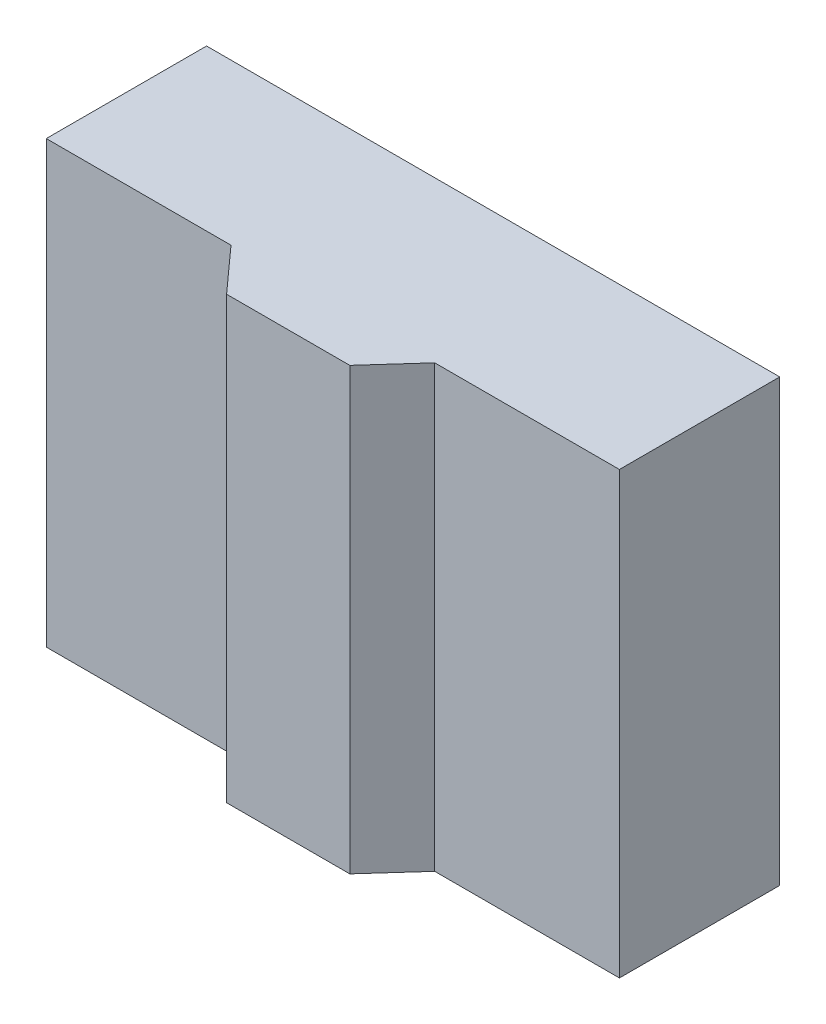
ISO-10303-21;
HEADER;
FILE_DESCRIPTION(('STEP AP214'),'2;1');
FILE_NAME('part.step','',(''),(''),'','','');
FILE_SCHEMA(('AUTOMOTIVE_DESIGN { 1 0 10303 214 1 1 1 1 }'));
ENDSEC;
DATA;
#1=APPLICATION_CONTEXT('core data for automotive mechanical design processes');
#2=APPLICATION_PROTOCOL_DEFINITION('international standard','automotive_design',2000,#1);
#3=PRODUCT_CONTEXT('',#1,'mechanical');
#4=PRODUCT('Part','Part','',(#3));
#5=PRODUCT_RELATED_PRODUCT_CATEGORY('part','',(#4));
#6=PRODUCT_DEFINITION_FORMATION('','',#4);
#7=PRODUCT_DEFINITION_CONTEXT('part definition',#1,'design');
#8=PRODUCT_DEFINITION('design','',#6,#7);
#9=PRODUCT_DEFINITION_SHAPE('','',#8);
#10=(LENGTH_UNIT() NAMED_UNIT(*) SI_UNIT(.MILLI.,.METRE.));
#11=(NAMED_UNIT(*) PLANE_ANGLE_UNIT() SI_UNIT($,.RADIAN.));
#12=(NAMED_UNIT(*) SI_UNIT($,.STERADIAN.) SOLID_ANGLE_UNIT());
#13=UNCERTAINTY_MEASURE_WITH_UNIT(LENGTH_MEASURE(1.E-05),#10,'distance_accuracy_value','');
#14=(GEOMETRIC_REPRESENTATION_CONTEXT(3) GLOBAL_UNCERTAINTY_ASSIGNED_CONTEXT((#13)) GLOBAL_UNIT_ASSIGNED_CONTEXT((#10,
#11,#12)) REPRESENTATION_CONTEXT('',''));
#15=CARTESIAN_POINT('',(0.,0.,0.));
#16=DIRECTION('',(0.,0.,1.));
#17=DIRECTION('',(1.,0.,0.));
#18=AXIS2_PLACEMENT_3D('',#15,#16,#17);
#19=CARTESIAN_POINT('',(0.,-101.6,-36.9812244108649));
#20=DIRECTION('',(0.,0.,-1.));
#21=DIRECTION('',(-1.,0.,0.));
#22=AXIS2_PLACEMENT_3D('',#19,#20,#21);
#23=PLANE('',#22);
#24=DIRECTION('',(-1.,0.,0.));
#25=VECTOR('',#24,1.);
#26=CARTESIAN_POINT('',(0.,0.,-36.9812244108649));
#27=LINE('',#26,#25);
#28=CARTESIAN_POINT('',(132.222754501209,0.,-36.9812244108649));
#29=VERTEX_POINT('',#28);
#30=CARTESIAN_POINT('',(0.,0.,-36.9812244108649));
#31=VERTEX_POINT('',#30);
#32=EDGE_CURVE('E128',#29,#31,#27,.T.);
#33=ORIENTED_EDGE('',*,*,#32,.F.);
#34=DIRECTION('',(0.,1.,0.));
#35=VECTOR('',#34,1.);
#36=CARTESIAN_POINT('',(132.222754501209,-101.6,-36.9812244108649));
#37=LINE('',#36,#35);
#38=CARTESIAN_POINT('',(132.222754501209,-101.6,-36.9812244108649));
#39=VERTEX_POINT('',#38);
#40=EDGE_CURVE('E11',#39,#29,#37,.T.);
#41=ORIENTED_EDGE('',*,*,#40,.F.);
#42=DIRECTION('',(-1.,0.,0.));
#43=VECTOR('',#42,1.);
#44=CARTESIAN_POINT('',(0.,-101.6,-36.9812244108649));
#45=LINE('',#44,#43);
#46=CARTESIAN_POINT('',(0.,-101.6,-36.9812244108649));
#47=VERTEX_POINT('',#46);
#48=EDGE_CURVE('E148',#39,#47,#45,.T.);
#49=ORIENTED_EDGE('',*,*,#48,.T.);
#50=DIRECTION('',(0.,1.,0.));
#51=VECTOR('',#50,1.);
#52=CARTESIAN_POINT('',(0.,-101.6,-36.9812244108649));
#53=LINE('',#52,#51);
#54=EDGE_CURVE('E34',#47,#31,#53,.T.);
#55=ORIENTED_EDGE('',*,*,#54,.T.);
#56=EDGE_LOOP('',(#33,#41,#49,#55));
#57=FACE_BOUND('',#56,.T.);
#58=ADVANCED_FACE('F31',(#57),#23,.T.);
#59=CARTESIAN_POINT('',(132.222754501209,-101.6,-36.9812244108649));
#60=DIRECTION('',(1.,0.,0.));
#61=DIRECTION('',(0.,0.,-1.));
#62=AXIS2_PLACEMENT_3D('',#59,#60,#61);
#63=PLANE('',#62);
#64=DIRECTION('',(0.,0.,-1.));
#65=VECTOR('',#64,1.);
#66=CARTESIAN_POINT('',(132.222754501209,0.,-36.9812244108649));
#67=LINE('',#66,#65);
#68=CARTESIAN_POINT('',(132.222754501209,0.,0.));
#69=VERTEX_POINT('',#68);
#70=EDGE_CURVE('E146',#69,#29,#67,.T.);
#71=ORIENTED_EDGE('',*,*,#70,.F.);
#72=DIRECTION('',(0.,1.,0.));
#73=VECTOR('',#72,1.);
#74=CARTESIAN_POINT('',(132.222754501209,-101.6,0.));
#75=LINE('',#74,#73);
#76=CARTESIAN_POINT('',(132.222754501209,-101.6,0.));
#77=VERTEX_POINT('',#76);
#78=EDGE_CURVE('E40',#77,#69,#75,.T.);
#79=ORIENTED_EDGE('',*,*,#78,.F.);
#80=DIRECTION('',(0.,0.,-1.));
#81=VECTOR('',#80,1.);
#82=CARTESIAN_POINT('',(132.222754501209,-101.6,-36.9812244108649));
#83=LINE('',#82,#81);
#84=EDGE_CURVE('E118',#77,#39,#83,.T.);
#85=ORIENTED_EDGE('',*,*,#84,.T.);
#86=ORIENTED_EDGE('',*,*,#40,.T.);
#87=EDGE_LOOP('',(#71,#79,#85,#86));
#88=FACE_BOUND('',#87,.T.);
#89=ADVANCED_FACE('F160',(#88),#63,.T.);
#90=CARTESIAN_POINT('',(132.222754501209,-101.6,0.));
#91=DIRECTION('',(0.,0.,1.));
#92=DIRECTION('',(1.,0.,0.));
#93=AXIS2_PLACEMENT_3D('',#90,#91,#92);
#94=PLANE('',#93);
#95=DIRECTION('',(1.,0.,0.));
#96=VECTOR('',#95,1.);
#97=CARTESIAN_POINT('',(132.222754501209,0.,0.));
#98=LINE('',#97,#96);
#99=CARTESIAN_POINT('',(89.6074006792826,0.,0.));
#100=VERTEX_POINT('',#99);
#101=EDGE_CURVE('E105',#100,#69,#98,.T.);
#102=ORIENTED_EDGE('',*,*,#101,.F.);
#103=DIRECTION('',(0.,1.,0.));
#104=VECTOR('',#103,1.);
#105=CARTESIAN_POINT('',(89.6074006792826,-101.6,0.));
#106=LINE('',#105,#104);
#107=CARTESIAN_POINT('',(89.6074006792826,-101.6,0.));
#108=VERTEX_POINT('',#107);
#109=EDGE_CURVE('E100',#108,#100,#106,.T.);
#110=ORIENTED_EDGE('',*,*,#109,.F.);
#111=DIRECTION('',(1.,0.,0.));
#112=VECTOR('',#111,1.);
#113=CARTESIAN_POINT('',(132.222754501209,-101.6,0.));
#114=LINE('',#113,#112);
#115=EDGE_CURVE('E103',#108,#77,#114,.T.);
#116=ORIENTED_EDGE('',*,*,#115,.T.);
#117=ORIENTED_EDGE('',*,*,#78,.T.);
#118=EDGE_LOOP('',(#102,#110,#116,#117));
#119=FACE_BOUND('',#118,.T.);
#120=ADVANCED_FACE('F102',(#119),#94,.T.);
#121=CARTESIAN_POINT('',(89.6074006792826,-101.6,0.));
#122=DIRECTION('',(0.742879016624116,0.,0.669425699132911));
#123=DIRECTION('',(0.669425699132911,0.,-0.742879016624116));
#124=AXIS2_PLACEMENT_3D('',#121,#122,#123);
#125=PLANE('',#124);
#126=DIRECTION('',(0.669425699132911,0.,-0.742879016624116));
#127=VECTOR('',#126,1.);
#128=CARTESIAN_POINT('',(89.6074006792826,0.,0.));
#129=LINE('',#128,#127);
#130=CARTESIAN_POINT('',(80.3250210531382,0.,10.3008968098083));
#131=VERTEX_POINT('',#130);
#132=EDGE_CURVE('E143',#131,#100,#129,.T.);
#133=ORIENTED_EDGE('',*,*,#132,.F.);
#134=DIRECTION('',(0.,1.,0.));
#135=VECTOR('',#134,1.);
#136=CARTESIAN_POINT('',(80.3250210531382,-101.6,10.3008968098083));
#137=LINE('',#136,#135);
#138=CARTESIAN_POINT('',(80.3250210531382,-101.6,10.3008968098083));
#139=VERTEX_POINT('',#138);
#140=EDGE_CURVE('E110',#139,#131,#137,.T.);
#141=ORIENTED_EDGE('',*,*,#140,.F.);
#142=DIRECTION('',(0.669425699132911,0.,-0.742879016624116));
#143=VECTOR('',#142,1.);
#144=CARTESIAN_POINT('',(89.6074006792826,-101.6,0.));
#145=LINE('',#144,#143);
#146=EDGE_CURVE('E116',#139,#108,#145,.T.);
#147=ORIENTED_EDGE('',*,*,#146,.T.);
#148=ORIENTED_EDGE('',*,*,#109,.T.);
#149=EDGE_LOOP('',(#133,#141,#147,#148));
#150=FACE_BOUND('',#149,.T.);
#151=ADVANCED_FACE('F120',(#150),#125,.T.);
#152=CARTESIAN_POINT('',(51.8977334480709,-101.6,10.3008968098083));
#153=DIRECTION('',(0.,0.,1.));
#154=DIRECTION('',(1.,0.,0.));
#155=AXIS2_PLACEMENT_3D('',#152,#153,#154);
#156=PLANE('',#155);
#157=DIRECTION('',(1.,0.,0.));
#158=VECTOR('',#157,1.);
#159=CARTESIAN_POINT('',(51.8977334480709,0.,10.3008968098083));
#160=LINE('',#159,#158);
#161=CARTESIAN_POINT('',(51.8977334480709,0.,10.3008968098083));
#162=VERTEX_POINT('',#161);
#163=EDGE_CURVE('E140',#162,#131,#160,.T.);
#164=ORIENTED_EDGE('',*,*,#163,.F.);
#165=DIRECTION('',(0.,1.,0.));
#166=VECTOR('',#165,1.);
#167=CARTESIAN_POINT('',(51.8977334480709,-101.6,10.3008968098083));
#168=LINE('',#167,#166);
#169=CARTESIAN_POINT('',(51.8977334480709,-101.6,10.3008968098083));
#170=VERTEX_POINT('',#169);
#171=EDGE_CURVE('E152',#170,#162,#168,.T.);
#172=ORIENTED_EDGE('',*,*,#171,.F.);
#173=DIRECTION('',(1.,0.,0.));
#174=VECTOR('',#173,1.);
#175=CARTESIAN_POINT('',(51.8977334480709,-101.6,10.3008968098083));
#176=LINE('',#175,#174);
#177=EDGE_CURVE('E121',#170,#139,#176,.T.);
#178=ORIENTED_EDGE('',*,*,#177,.T.);
#179=ORIENTED_EDGE('',*,*,#140,.T.);
#180=EDGE_LOOP('',(#164,#172,#178,#179));
#181=FACE_BOUND('',#180,.T.);
#182=ADVANCED_FACE('F173',(#181),#156,.T.);
#183=CARTESIAN_POINT('',(42.6153538219265,-101.6,0.));
#184=DIRECTION('',(-0.742879016624116,0.,0.669425699132911));
#185=DIRECTION('',(0.669425699132911,0.,0.742879016624116));
#186=AXIS2_PLACEMENT_3D('',#183,#184,#185);
#187=PLANE('',#186);
#188=DIRECTION('',(0.669425699132911,0.,0.742879016624116));
#189=VECTOR('',#188,1.);
#190=CARTESIAN_POINT('',(42.6153538219265,0.,0.));
#191=LINE('',#190,#189);
#192=CARTESIAN_POINT('',(42.6153538219265,0.,0.));
#193=VERTEX_POINT('',#192);
#194=EDGE_CURVE('E137',#193,#162,#191,.T.);
#195=ORIENTED_EDGE('',*,*,#194,.F.);
#196=DIRECTION('',(0.,1.,0.));
#197=VECTOR('',#196,1.);
#198=CARTESIAN_POINT('',(42.6153538219265,-101.6,0.));
#199=LINE('',#198,#197);
#200=CARTESIAN_POINT('',(42.6153538219265,-101.6,0.));
#201=VERTEX_POINT('',#200);
#202=EDGE_CURVE('E154',#201,#193,#199,.T.);
#203=ORIENTED_EDGE('',*,*,#202,.F.);
#204=DIRECTION('',(0.669425699132911,0.,0.742879016624116));
#205=VECTOR('',#204,1.);
#206=CARTESIAN_POINT('',(42.6153538219265,-101.6,0.));
#207=LINE('',#206,#205);
#208=EDGE_CURVE('E123',#201,#170,#207,.T.);
#209=ORIENTED_EDGE('',*,*,#208,.T.);
#210=ORIENTED_EDGE('',*,*,#171,.T.);
#211=EDGE_LOOP('',(#195,#203,#209,#210));
#212=FACE_BOUND('',#211,.T.);
#213=ADVANCED_FACE('F176',(#212),#187,.T.);
#214=CARTESIAN_POINT('',(0.,-101.6,0.));
#215=DIRECTION('',(0.,0.,1.));
#216=DIRECTION('',(1.,0.,0.));
#217=AXIS2_PLACEMENT_3D('',#214,#215,#216);
#218=PLANE('',#217);
#219=DIRECTION('',(1.,0.,0.));
#220=VECTOR('',#219,1.);
#221=CARTESIAN_POINT('',(0.,0.,0.));
#222=LINE('',#221,#220);
#223=CARTESIAN_POINT('',(0.,0.,0.));
#224=VERTEX_POINT('',#223);
#225=EDGE_CURVE('E134',#224,#193,#222,.T.);
#226=ORIENTED_EDGE('',*,*,#225,.F.);
#227=DIRECTION('',(0.,1.,0.));
#228=VECTOR('',#227,1.);
#229=CARTESIAN_POINT('',(0.,-101.6,0.));
#230=LINE('',#229,#228);
#231=CARTESIAN_POINT('',(0.,-101.6,0.));
#232=VERTEX_POINT('',#231);
#233=EDGE_CURVE('E155',#232,#224,#230,.T.);
#234=ORIENTED_EDGE('',*,*,#233,.F.);
#235=DIRECTION('',(1.,0.,0.));
#236=VECTOR('',#235,1.);
#237=CARTESIAN_POINT('',(0.,-101.6,0.));
#238=LINE('',#237,#236);
#239=EDGE_CURVE('E251',#232,#201,#238,.T.);
#240=ORIENTED_EDGE('',*,*,#239,.T.);
#241=ORIENTED_EDGE('',*,*,#202,.T.);
#242=EDGE_LOOP('',(#226,#234,#240,#241));
#243=FACE_BOUND('',#242,.T.);
#244=ADVANCED_FACE('F180',(#243),#218,.T.);
#245=CARTESIAN_POINT('',(0.,-101.6,-36.9812244108649));
#246=DIRECTION('',(-1.,0.,0.));
#247=DIRECTION('',(0.,0.,1.));
#248=AXIS2_PLACEMENT_3D('',#245,#246,#247);
#249=PLANE('',#248);
#250=DIRECTION('',(0.,0.,1.));
#251=VECTOR('',#250,1.);
#252=CARTESIAN_POINT('',(0.,0.,-36.9812244108649));
#253=LINE('',#252,#251);
#254=EDGE_CURVE('E131',#31,#224,#253,.T.);
#255=ORIENTED_EDGE('',*,*,#254,.F.);
#256=ORIENTED_EDGE('',*,*,#54,.F.);
#257=DIRECTION('',(0.,0.,1.));
#258=VECTOR('',#257,1.);
#259=CARTESIAN_POINT('',(0.,-101.6,-36.9812244108649));
#260=LINE('',#259,#258);
#261=EDGE_CURVE('E252',#47,#232,#260,.T.);
#262=ORIENTED_EDGE('',*,*,#261,.T.);
#263=ORIENTED_EDGE('',*,*,#233,.T.);
#264=EDGE_LOOP('',(#255,#256,#262,#263));
#265=FACE_BOUND('',#264,.T.);
#266=ADVANCED_FACE('F157',(#265),#249,.T.);
#267=CARTESIAN_POINT('',(132.222754501209,-101.6,-36.9812244108649));
#268=DIRECTION('',(0.,-1.,0.));
#269=DIRECTION('',(0.,0.,-1.));
#270=AXIS2_PLACEMENT_3D('',#267,#268,#269);
#271=PLANE('',#270);
#272=ORIENTED_EDGE('',*,*,#48,.F.);
#273=ORIENTED_EDGE('',*,*,#84,.F.);
#274=ORIENTED_EDGE('',*,*,#115,.F.);
#275=ORIENTED_EDGE('',*,*,#146,.F.);
#276=ORIENTED_EDGE('',*,*,#177,.F.);
#277=ORIENTED_EDGE('',*,*,#208,.F.);
#278=ORIENTED_EDGE('',*,*,#239,.F.);
#279=ORIENTED_EDGE('',*,*,#261,.F.);
#280=EDGE_LOOP('',(#272,#273,#274,#275,#276,#277,#278,#279));
#281=FACE_BOUND('',#280,.T.);
#282=ADVANCED_FACE('F114',(#281),#271,.T.);
#283=CARTESIAN_POINT('',(132.222754501209,0.,-36.9812244108649));
#284=DIRECTION('',(0.,-1.,0.));
#285=DIRECTION('',(0.,0.,-1.));
#286=AXIS2_PLACEMENT_3D('',#283,#284,#285);
#287=PLANE('',#286);
#288=ORIENTED_EDGE('',*,*,#32,.T.);
#289=ORIENTED_EDGE('',*,*,#254,.T.);
#290=ORIENTED_EDGE('',*,*,#225,.T.);
#291=ORIENTED_EDGE('',*,*,#194,.T.);
#292=ORIENTED_EDGE('',*,*,#163,.T.);
#293=ORIENTED_EDGE('',*,*,#132,.T.);
#294=ORIENTED_EDGE('',*,*,#101,.T.);
#295=ORIENTED_EDGE('',*,*,#70,.T.);
#296=EDGE_LOOP('',(#288,#289,#290,#291,#292,#293,#294,#295));
#297=FACE_BOUND('',#296,.T.);
#298=ADVANCED_FACE('F159',(#297),#287,.F.);
#299=CLOSED_SHELL('',(#58,#89,#120,#151,#182,#213,#244,#266,#282,#298));
#300=MANIFOLD_SOLID_BREP('B2',#299);
#301=ADVANCED_BREP_SHAPE_REPRESENTATION('',(#18,#300),#14);
#302=SHAPE_DEFINITION_REPRESENTATION(#9,#301);
ENDSEC;
END-ISO-10303-21;
